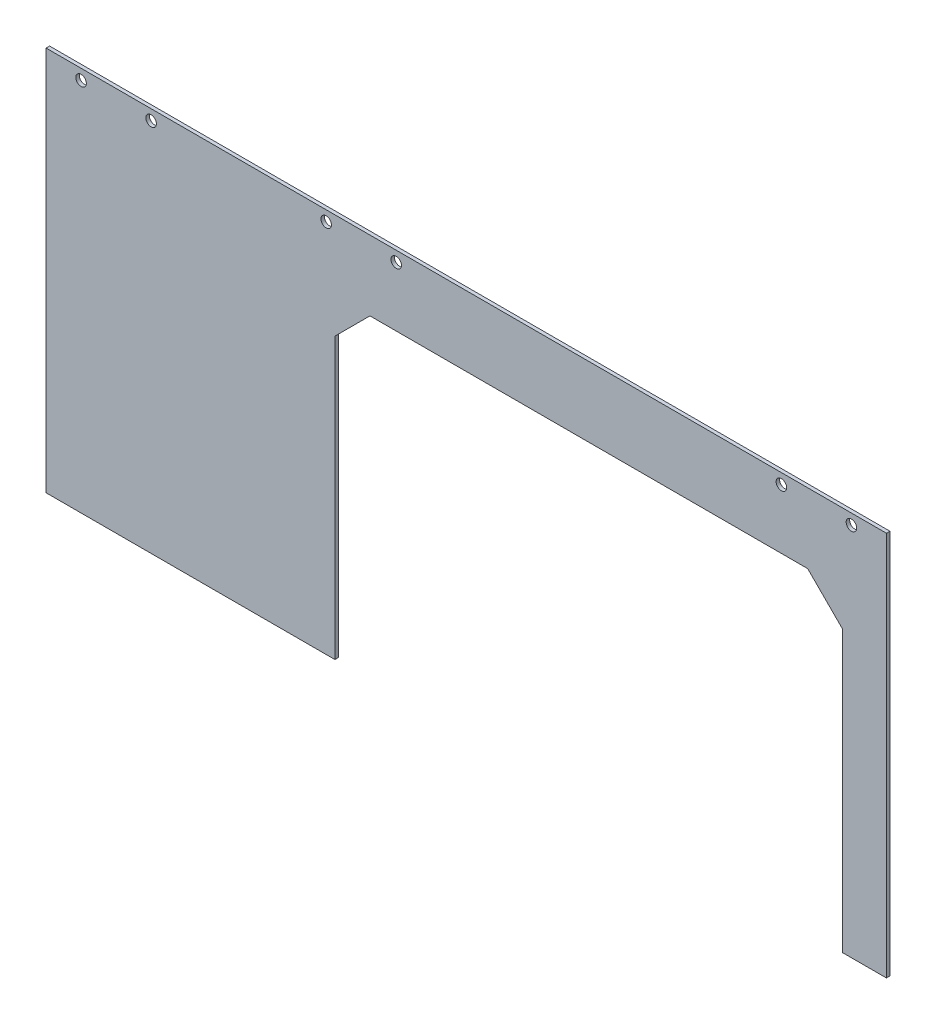
ISO-10303-21;
HEADER;
FILE_DESCRIPTION(('STEP AP214'),'2;1');
FILE_NAME('part.step','',(''),(''),'','','');
FILE_SCHEMA(('AUTOMOTIVE_DESIGN { 1 0 10303 214 1 1 1 1 }'));
ENDSEC;
DATA;
#1=APPLICATION_CONTEXT('core data for automotive mechanical design processes');
#2=APPLICATION_PROTOCOL_DEFINITION('international standard','automotive_design',2000,#1);
#3=PRODUCT_CONTEXT('',#1,'mechanical');
#4=PRODUCT('Part','Part','',(#3));
#5=PRODUCT_RELATED_PRODUCT_CATEGORY('part','',(#4));
#6=PRODUCT_DEFINITION_FORMATION('','',#4);
#7=PRODUCT_DEFINITION_CONTEXT('part definition',#1,'design');
#8=PRODUCT_DEFINITION('design','',#6,#7);
#9=PRODUCT_DEFINITION_SHAPE('','',#8);
#10=(LENGTH_UNIT() NAMED_UNIT(*) SI_UNIT(.MILLI.,.METRE.));
#11=(NAMED_UNIT(*) PLANE_ANGLE_UNIT() SI_UNIT($,.RADIAN.));
#12=(NAMED_UNIT(*) SI_UNIT($,.STERADIAN.) SOLID_ANGLE_UNIT());
#13=UNCERTAINTY_MEASURE_WITH_UNIT(LENGTH_MEASURE(1.E-05),#10,'distance_accuracy_value','');
#14=(GEOMETRIC_REPRESENTATION_CONTEXT(3) GLOBAL_UNCERTAINTY_ASSIGNED_CONTEXT((#13)) GLOBAL_UNIT_ASSIGNED_CONTEXT((#10,
#11,#12)) REPRESENTATION_CONTEXT('',''));
#15=CARTESIAN_POINT('',(0.,0.,0.));
#16=DIRECTION('',(0.,0.,1.));
#17=DIRECTION('',(1.,0.,0.));
#18=AXIS2_PLACEMENT_3D('',#15,#16,#17);
#19=CARTESIAN_POINT('',(0.,0.,1.));
#20=DIRECTION('',(0.,0.,-1.));
#21=DIRECTION('',(-1.,0.,0.));
#22=AXIS2_PLACEMENT_3D('',#19,#20,#21);
#23=PLANE('',#22);
#24=DIRECTION('',(1.,0.,0.));
#25=VECTOR('',#24,1.);
#26=CARTESIAN_POINT('',(82.5,0.,1.));
#27=LINE('',#26,#25);
#28=CARTESIAN_POINT('',(0.,0.,1.));
#29=VERTEX_POINT('',#28);
#30=CARTESIAN_POINT('',(82.5,0.,1.));
#31=VERTEX_POINT('',#30);
#32=EDGE_CURVE('E126',#29,#31,#27,.T.);
#33=ORIENTED_EDGE('',*,*,#32,.T.);
#34=DIRECTION('',(0.,1.,0.));
#35=VECTOR('',#34,1.);
#36=CARTESIAN_POINT('',(82.5,90.,1.));
#37=LINE('',#36,#35);
#38=CARTESIAN_POINT('',(82.5,80.,1.));
#39=VERTEX_POINT('',#38);
#40=EDGE_CURVE('E117',#31,#39,#37,.T.);
#41=ORIENTED_EDGE('',*,*,#40,.T.);
#42=DIRECTION('',(-0.707106781186551,-0.707106781186544,0.));
#43=VECTOR('',#42,1.);
#44=CARTESIAN_POINT('',(1.24999999999953,-1.24999999999954,1.));
#45=LINE('',#44,#43);
#46=CARTESIAN_POINT('',(92.5,90.,1.));
#47=VERTEX_POINT('',#46);
#48=EDGE_CURVE('E11',#39,#47,#45,.F.);
#49=ORIENTED_EDGE('',*,*,#48,.T.);
#50=DIRECTION('',(1.,0.,0.));
#51=VECTOR('',#50,1.);
#52=CARTESIAN_POINT('',(82.5,90.,1.));
#53=LINE('',#52,#51);
#54=CARTESIAN_POINT('',(217.5,90.,1.));
#55=VERTEX_POINT('',#54);
#56=EDGE_CURVE('E125',#47,#55,#53,.T.);
#57=ORIENTED_EDGE('',*,*,#56,.T.);
#58=DIRECTION('',(-0.707106781186544,0.707106781186551,0.));
#59=VECTOR('',#58,1.);
#60=CARTESIAN_POINT('',(153.750000000001,153.749999999999,1.));
#61=LINE('',#60,#59);
#62=CARTESIAN_POINT('',(227.5,79.9999999999998,1.));
#63=VERTEX_POINT('',#62);
#64=EDGE_CURVE('E158',#55,#63,#61,.F.);
#65=ORIENTED_EDGE('',*,*,#64,.T.);
#66=DIRECTION('',(0.,-1.,0.));
#67=VECTOR('',#66,1.);
#68=CARTESIAN_POINT('',(227.5,90.,1.));
#69=LINE('',#68,#67);
#70=CARTESIAN_POINT('',(227.5,0.,1.));
#71=VERTEX_POINT('',#70);
#72=EDGE_CURVE('E162',#63,#71,#69,.T.);
#73=ORIENTED_EDGE('',*,*,#72,.T.);
#74=DIRECTION('',(1.,0.,0.));
#75=VECTOR('',#74,1.);
#76=CARTESIAN_POINT('',(227.5,0.,1.));
#77=LINE('',#76,#75);
#78=CARTESIAN_POINT('',(240.,0.,1.));
#79=VERTEX_POINT('',#78);
#80=EDGE_CURVE('E172',#71,#79,#77,.T.);
#81=ORIENTED_EDGE('',*,*,#80,.T.);
#82=DIRECTION('',(0.,1.,0.));
#83=VECTOR('',#82,1.);
#84=CARTESIAN_POINT('',(240.,0.,1.));
#85=LINE('',#84,#83);
#86=CARTESIAN_POINT('',(240.,110.,1.));
#87=VERTEX_POINT('',#86);
#88=EDGE_CURVE('E211',#79,#87,#85,.T.);
#89=ORIENTED_EDGE('',*,*,#88,.T.);
#90=DIRECTION('',(-1.,0.,0.));
#91=VECTOR('',#90,1.);
#92=CARTESIAN_POINT('',(0.,110.,1.));
#93=LINE('',#92,#91);
#94=CARTESIAN_POINT('',(0.,110.,1.));
#95=VERTEX_POINT('',#94);
#96=EDGE_CURVE('E221',#87,#95,#93,.T.);
#97=ORIENTED_EDGE('',*,*,#96,.T.);
#98=DIRECTION('',(0.,-1.,0.));
#99=VECTOR('',#98,1.);
#100=CARTESIAN_POINT('',(0.,0.,1.));
#101=LINE('',#100,#99);
#102=EDGE_CURVE('E131',#95,#29,#101,.T.);
#103=ORIENTED_EDGE('',*,*,#102,.T.);
#104=EDGE_LOOP('',(#33,#41,#49,#57,#65,#73,#81,#89,#97,#103));
#105=FACE_BOUND('',#104,.T.);
#106=CARTESIAN_POINT('',(10.,107.,1.));
#107=DIRECTION('',(0.,0.,1.));
#108=DIRECTION('',(1.,0.,0.));
#109=AXIS2_PLACEMENT_3D('',#106,#107,#108);
#110=CIRCLE('',#109,1.5);
#111=CARTESIAN_POINT('',(11.5,107.,1.));
#112=VERTEX_POINT('',#111);
#113=EDGE_CURVE('E225',#112,#112,#110,.T.);
#114=ORIENTED_EDGE('',*,*,#113,.F.);
#115=EDGE_LOOP('',(#114));
#116=FACE_BOUND('',#115,.T.);
#117=CARTESIAN_POINT('',(30.,107.,1.));
#118=DIRECTION('',(0.,0.,1.));
#119=DIRECTION('',(1.,0.,0.));
#120=AXIS2_PLACEMENT_3D('',#117,#118,#119);
#121=CIRCLE('',#120,1.50000000000001);
#122=CARTESIAN_POINT('',(31.5,107.,1.));
#123=VERTEX_POINT('',#122);
#124=EDGE_CURVE('E232',#123,#123,#121,.T.);
#125=ORIENTED_EDGE('',*,*,#124,.F.);
#126=EDGE_LOOP('',(#125));
#127=FACE_BOUND('',#126,.T.);
#128=CARTESIAN_POINT('',(210.,107.,1.));
#129=DIRECTION('',(0.,0.,1.));
#130=DIRECTION('',(1.,0.,0.));
#131=AXIS2_PLACEMENT_3D('',#128,#129,#130);
#132=CIRCLE('',#131,1.5);
#133=CARTESIAN_POINT('',(211.5,107.,1.));
#134=VERTEX_POINT('',#133);
#135=EDGE_CURVE('E424',#134,#134,#132,.T.);
#136=ORIENTED_EDGE('',*,*,#135,.F.);
#137=EDGE_LOOP('',(#136));
#138=FACE_BOUND('',#137,.T.);
#139=CARTESIAN_POINT('',(230.,107.,1.));
#140=DIRECTION('',(0.,0.,1.));
#141=DIRECTION('',(1.,0.,0.));
#142=AXIS2_PLACEMENT_3D('',#139,#140,#141);
#143=CIRCLE('',#142,1.5);
#144=CARTESIAN_POINT('',(231.5,107.,1.));
#145=VERTEX_POINT('',#144);
#146=EDGE_CURVE('E418',#145,#145,#143,.T.);
#147=ORIENTED_EDGE('',*,*,#146,.F.);
#148=EDGE_LOOP('',(#147));
#149=FACE_BOUND('',#148,.T.);
#150=CARTESIAN_POINT('',(80.,107.,1.));
#151=DIRECTION('',(0.,0.,1.));
#152=DIRECTION('',(-1.,0.,0.));
#153=AXIS2_PLACEMENT_3D('',#150,#151,#152);
#154=CIRCLE('',#153,1.5);
#155=CARTESIAN_POINT('',(78.5,107.,1.));
#156=VERTEX_POINT('',#155);
#157=EDGE_CURVE('E412',#156,#156,#154,.T.);
#158=ORIENTED_EDGE('',*,*,#157,.F.);
#159=EDGE_LOOP('',(#158));
#160=FACE_BOUND('',#159,.T.);
#161=CARTESIAN_POINT('',(99.9999999999999,107.,1.));
#162=DIRECTION('',(0.,0.,1.));
#163=DIRECTION('',(-1.,0.,0.));
#164=AXIS2_PLACEMENT_3D('',#161,#162,#163);
#165=CIRCLE('',#164,1.5);
#166=CARTESIAN_POINT('',(98.4999999999999,107.,1.));
#167=VERTEX_POINT('',#166);
#168=EDGE_CURVE('E403',#167,#167,#165,.T.);
#169=ORIENTED_EDGE('',*,*,#168,.F.);
#170=EDGE_LOOP('',(#169));
#171=FACE_BOUND('',#170,.T.);
#172=ADVANCED_FACE('F43',(#105,#116,#127,#138,#149,#160,#171),#23,.F.);
#173=CARTESIAN_POINT('',(0.,0.,0.));
#174=DIRECTION('',(0.,0.,-1.));
#175=DIRECTION('',(-1.,0.,0.));
#176=AXIS2_PLACEMENT_3D('',#173,#174,#175);
#177=PLANE('',#176);
#178=CARTESIAN_POINT('',(80.,107.,0.));
#179=DIRECTION('',(0.,0.,1.));
#180=DIRECTION('',(-1.,0.,0.));
#181=AXIS2_PLACEMENT_3D('',#178,#179,#180);
#182=CIRCLE('',#181,1.5);
#183=CARTESIAN_POINT('',(78.5,107.,0.));
#184=VERTEX_POINT('',#183);
#185=EDGE_CURVE('E409',#184,#184,#182,.T.);
#186=ORIENTED_EDGE('',*,*,#185,.T.);
#187=EDGE_LOOP('',(#186));
#188=FACE_BOUND('',#187,.T.);
#189=CARTESIAN_POINT('',(210.,107.,0.));
#190=DIRECTION('',(0.,0.,1.));
#191=DIRECTION('',(1.,0.,0.));
#192=AXIS2_PLACEMENT_3D('',#189,#190,#191);
#193=CIRCLE('',#192,1.5);
#194=CARTESIAN_POINT('',(211.5,107.,0.));
#195=VERTEX_POINT('',#194);
#196=EDGE_CURVE('E421',#195,#195,#193,.T.);
#197=ORIENTED_EDGE('',*,*,#196,.T.);
#198=EDGE_LOOP('',(#197));
#199=FACE_BOUND('',#198,.T.);
#200=CARTESIAN_POINT('',(10.,107.,0.));
#201=DIRECTION('',(0.,0.,1.));
#202=DIRECTION('',(1.,0.,0.));
#203=AXIS2_PLACEMENT_3D('',#200,#201,#202);
#204=CIRCLE('',#203,1.5);
#205=CARTESIAN_POINT('',(11.5,107.,0.));
#206=VERTEX_POINT('',#205);
#207=EDGE_CURVE('E227',#206,#206,#204,.T.);
#208=ORIENTED_EDGE('',*,*,#207,.T.);
#209=EDGE_LOOP('',(#208));
#210=FACE_BOUND('',#209,.T.);
#211=DIRECTION('',(1.,0.,0.));
#212=VECTOR('',#211,1.);
#213=CARTESIAN_POINT('',(82.5,0.,0.));
#214=LINE('',#213,#212);
#215=CARTESIAN_POINT('',(0.,0.,0.));
#216=VERTEX_POINT('',#215);
#217=CARTESIAN_POINT('',(82.5,0.,0.));
#218=VERTEX_POINT('',#217);
#219=EDGE_CURVE('E139',#216,#218,#214,.T.);
#220=ORIENTED_EDGE('',*,*,#219,.F.);
#221=DIRECTION('',(0.,-1.,0.));
#222=VECTOR('',#221,1.);
#223=CARTESIAN_POINT('',(0.,0.,0.));
#224=LINE('',#223,#222);
#225=CARTESIAN_POINT('',(0.,110.,0.));
#226=VERTEX_POINT('',#225);
#227=EDGE_CURVE('E135',#226,#216,#224,.T.);
#228=ORIENTED_EDGE('',*,*,#227,.F.);
#229=DIRECTION('',(-1.,0.,0.));
#230=VECTOR('',#229,1.);
#231=CARTESIAN_POINT('',(0.,110.,0.));
#232=LINE('',#231,#230);
#233=CARTESIAN_POINT('',(240.,110.,0.));
#234=VERTEX_POINT('',#233);
#235=EDGE_CURVE('E194',#234,#226,#232,.T.);
#236=ORIENTED_EDGE('',*,*,#235,.F.);
#237=DIRECTION('',(0.,1.,0.));
#238=VECTOR('',#237,1.);
#239=CARTESIAN_POINT('',(240.,0.,0.));
#240=LINE('',#239,#238);
#241=CARTESIAN_POINT('',(240.,0.,0.));
#242=VERTEX_POINT('',#241);
#243=EDGE_CURVE('E192',#242,#234,#240,.T.);
#244=ORIENTED_EDGE('',*,*,#243,.F.);
#245=DIRECTION('',(1.,0.,0.));
#246=VECTOR('',#245,1.);
#247=CARTESIAN_POINT('',(227.5,0.,0.));
#248=LINE('',#247,#246);
#249=CARTESIAN_POINT('',(227.5,0.,0.));
#250=VERTEX_POINT('',#249);
#251=EDGE_CURVE('E186',#250,#242,#248,.T.);
#252=ORIENTED_EDGE('',*,*,#251,.F.);
#253=DIRECTION('',(0.,-1.,0.));
#254=VECTOR('',#253,1.);
#255=CARTESIAN_POINT('',(227.5,90.,0.));
#256=LINE('',#255,#254);
#257=CARTESIAN_POINT('',(227.5,79.9999999999998,0.));
#258=VERTEX_POINT('',#257);
#259=EDGE_CURVE('E180',#258,#250,#256,.T.);
#260=ORIENTED_EDGE('',*,*,#259,.F.);
#261=DIRECTION('',(0.707106781186544,-0.707106781186551,0.));
#262=VECTOR('',#261,1.);
#263=CARTESIAN_POINT('',(227.5,79.9999999999998,0.));
#264=LINE('',#263,#262);
#265=CARTESIAN_POINT('',(217.5,90.,0.));
#266=VERTEX_POINT('',#265);
#267=EDGE_CURVE('E156',#258,#266,#264,.F.);
#268=ORIENTED_EDGE('',*,*,#267,.T.);
#269=DIRECTION('',(1.,0.,0.));
#270=VECTOR('',#269,1.);
#271=CARTESIAN_POINT('',(82.5,90.,0.));
#272=LINE('',#271,#270);
#273=CARTESIAN_POINT('',(92.5,90.,0.));
#274=VERTEX_POINT('',#273);
#275=EDGE_CURVE('E178',#274,#266,#272,.T.);
#276=ORIENTED_EDGE('',*,*,#275,.F.);
#277=DIRECTION('',(0.707106781186551,0.707106781186544,0.));
#278=VECTOR('',#277,1.);
#279=CARTESIAN_POINT('',(92.5,90.,0.));
#280=LINE('',#279,#278);
#281=CARTESIAN_POINT('',(82.5,80.,0.));
#282=VERTEX_POINT('',#281);
#283=EDGE_CURVE('E52',#274,#282,#280,.F.);
#284=ORIENTED_EDGE('',*,*,#283,.T.);
#285=DIRECTION('',(0.,1.,0.));
#286=VECTOR('',#285,1.);
#287=CARTESIAN_POINT('',(82.5,90.,0.));
#288=LINE('',#287,#286);
#289=EDGE_CURVE('E184',#218,#282,#288,.T.);
#290=ORIENTED_EDGE('',*,*,#289,.F.);
#291=EDGE_LOOP('',(#220,#228,#236,#244,#252,#260,#268,#276,#284,#290));
#292=FACE_BOUND('',#291,.T.);
#293=CARTESIAN_POINT('',(30.,107.,0.));
#294=DIRECTION('',(0.,0.,1.));
#295=DIRECTION('',(1.,0.,0.));
#296=AXIS2_PLACEMENT_3D('',#293,#294,#295);
#297=CIRCLE('',#296,1.50000000000001);
#298=CARTESIAN_POINT('',(31.5,107.,0.));
#299=VERTEX_POINT('',#298);
#300=EDGE_CURVE('E235',#299,#299,#297,.T.);
#301=ORIENTED_EDGE('',*,*,#300,.T.);
#302=EDGE_LOOP('',(#301));
#303=FACE_BOUND('',#302,.T.);
#304=CARTESIAN_POINT('',(230.,107.,0.));
#305=DIRECTION('',(0.,0.,1.));
#306=DIRECTION('',(1.,0.,0.));
#307=AXIS2_PLACEMENT_3D('',#304,#305,#306);
#308=CIRCLE('',#307,1.5);
#309=CARTESIAN_POINT('',(231.5,107.,0.));
#310=VERTEX_POINT('',#309);
#311=EDGE_CURVE('E415',#310,#310,#308,.T.);
#312=ORIENTED_EDGE('',*,*,#311,.T.);
#313=EDGE_LOOP('',(#312));
#314=FACE_BOUND('',#313,.T.);
#315=CARTESIAN_POINT('',(99.9999999999999,107.,0.));
#316=DIRECTION('',(0.,0.,1.));
#317=DIRECTION('',(-1.,0.,0.));
#318=AXIS2_PLACEMENT_3D('',#315,#316,#317);
#319=CIRCLE('',#318,1.5);
#320=CARTESIAN_POINT('',(98.4999999999999,107.,0.));
#321=VERTEX_POINT('',#320);
#322=EDGE_CURVE('E406',#321,#321,#319,.T.);
#323=ORIENTED_EDGE('',*,*,#322,.T.);
#324=EDGE_LOOP('',(#323));
#325=FACE_BOUND('',#324,.T.);
#326=ADVANCED_FACE('F176',(#188,#199,#210,#292,#303,#314,#325),#177,.T.);
#327=CARTESIAN_POINT('',(82.5,0.,1.));
#328=DIRECTION('',(0.,1.,0.));
#329=DIRECTION('',(0.,0.,1.));
#330=AXIS2_PLACEMENT_3D('',#327,#328,#329);
#331=PLANE('',#330);
#332=ORIENTED_EDGE('',*,*,#219,.T.);
#333=DIRECTION('',(0.,0.,-1.));
#334=VECTOR('',#333,1.);
#335=CARTESIAN_POINT('',(82.5,0.,1.));
#336=LINE('',#335,#334);
#337=EDGE_CURVE('E121',#31,#218,#336,.T.);
#338=ORIENTED_EDGE('',*,*,#337,.F.);
#339=ORIENTED_EDGE('',*,*,#32,.F.);
#340=DIRECTION('',(0.,0.,-1.));
#341=VECTOR('',#340,1.);
#342=CARTESIAN_POINT('',(0.,0.,1.));
#343=LINE('',#342,#341);
#344=EDGE_CURVE('E197',#29,#216,#343,.T.);
#345=ORIENTED_EDGE('',*,*,#344,.T.);
#346=EDGE_LOOP('',(#332,#338,#339,#345));
#347=FACE_BOUND('',#346,.T.);
#348=ADVANCED_FACE('F137',(#347),#331,.F.);
#349=CARTESIAN_POINT('',(82.5,90.,1.));
#350=DIRECTION('',(-1.,0.,0.));
#351=DIRECTION('',(0.,-1.,0.));
#352=AXIS2_PLACEMENT_3D('',#349,#350,#351);
#353=PLANE('',#352);
#354=ORIENTED_EDGE('',*,*,#289,.T.);
#355=DIRECTION('',(0.,0.,1.));
#356=VECTOR('',#355,1.);
#357=CARTESIAN_POINT('',(82.5,80.,1.));
#358=LINE('',#357,#356);
#359=EDGE_CURVE('E59',#282,#39,#358,.T.);
#360=ORIENTED_EDGE('',*,*,#359,.T.);
#361=ORIENTED_EDGE('',*,*,#40,.F.);
#362=ORIENTED_EDGE('',*,*,#337,.T.);
#363=EDGE_LOOP('',(#354,#360,#361,#362));
#364=FACE_BOUND('',#363,.T.);
#365=ADVANCED_FACE('F119',(#364),#353,.F.);
#366=CARTESIAN_POINT('',(82.5,90.,1.));
#367=DIRECTION('',(0.,1.,0.));
#368=DIRECTION('',(0.,0.,1.));
#369=AXIS2_PLACEMENT_3D('',#366,#367,#368);
#370=PLANE('',#369);
#371=ORIENTED_EDGE('',*,*,#275,.T.);
#372=DIRECTION('',(0.,0.,1.));
#373=VECTOR('',#372,1.);
#374=CARTESIAN_POINT('',(217.5,90.,1.));
#375=LINE('',#374,#373);
#376=EDGE_CURVE('E153',#266,#55,#375,.T.);
#377=ORIENTED_EDGE('',*,*,#376,.T.);
#378=ORIENTED_EDGE('',*,*,#56,.F.);
#379=DIRECTION('',(0.,0.,-1.));
#380=VECTOR('',#379,1.);
#381=CARTESIAN_POINT('',(92.5,90.,0.));
#382=LINE('',#381,#380);
#383=EDGE_CURVE('E144',#47,#274,#382,.T.);
#384=ORIENTED_EDGE('',*,*,#383,.T.);
#385=EDGE_LOOP('',(#371,#377,#378,#384));
#386=FACE_BOUND('',#385,.T.);
#387=ADVANCED_FACE('F182',(#386),#370,.F.);
#388=CARTESIAN_POINT('',(227.5,90.,1.));
#389=DIRECTION('',(1.,0.,0.));
#390=DIRECTION('',(0.,1.,0.));
#391=AXIS2_PLACEMENT_3D('',#388,#389,#390);
#392=PLANE('',#391);
#393=ORIENTED_EDGE('',*,*,#72,.F.);
#394=DIRECTION('',(0.,0.,-1.));
#395=VECTOR('',#394,1.);
#396=CARTESIAN_POINT('',(227.5,79.9999999999998,0.));
#397=LINE('',#396,#395);
#398=EDGE_CURVE('E140',#63,#258,#397,.T.);
#399=ORIENTED_EDGE('',*,*,#398,.T.);
#400=ORIENTED_EDGE('',*,*,#259,.T.);
#401=DIRECTION('',(0.,0.,-1.));
#402=VECTOR('',#401,1.);
#403=CARTESIAN_POINT('',(227.5,0.,1.));
#404=LINE('',#403,#402);
#405=EDGE_CURVE('E141',#71,#250,#404,.T.);
#406=ORIENTED_EDGE('',*,*,#405,.F.);
#407=EDGE_LOOP('',(#393,#399,#400,#406));
#408=FACE_BOUND('',#407,.T.);
#409=ADVANCED_FACE('F169',(#408),#392,.F.);
#410=CARTESIAN_POINT('',(227.5,0.,1.));
#411=DIRECTION('',(0.,1.,0.));
#412=DIRECTION('',(-1.,0.,0.));
#413=AXIS2_PLACEMENT_3D('',#410,#411,#412);
#414=PLANE('',#413);
#415=ORIENTED_EDGE('',*,*,#251,.T.);
#416=DIRECTION('',(0.,0.,-1.));
#417=VECTOR('',#416,1.);
#418=CARTESIAN_POINT('',(240.,0.,1.));
#419=LINE('',#418,#417);
#420=EDGE_CURVE('E147',#79,#242,#419,.T.);
#421=ORIENTED_EDGE('',*,*,#420,.F.);
#422=ORIENTED_EDGE('',*,*,#80,.F.);
#423=ORIENTED_EDGE('',*,*,#405,.T.);
#424=EDGE_LOOP('',(#415,#421,#422,#423));
#425=FACE_BOUND('',#424,.T.);
#426=ADVANCED_FACE('F239',(#425),#414,.F.);
#427=CARTESIAN_POINT('',(240.,0.,1.));
#428=DIRECTION('',(-1.,0.,0.));
#429=DIRECTION('',(0.,0.,1.));
#430=AXIS2_PLACEMENT_3D('',#427,#428,#429);
#431=PLANE('',#430);
#432=ORIENTED_EDGE('',*,*,#243,.T.);
#433=DIRECTION('',(0.,0.,-1.));
#434=VECTOR('',#433,1.);
#435=CARTESIAN_POINT('',(240.,110.,1.));
#436=LINE('',#435,#434);
#437=EDGE_CURVE('E202',#87,#234,#436,.T.);
#438=ORIENTED_EDGE('',*,*,#437,.F.);
#439=ORIENTED_EDGE('',*,*,#88,.F.);
#440=ORIENTED_EDGE('',*,*,#420,.T.);
#441=EDGE_LOOP('',(#432,#438,#439,#440));
#442=FACE_BOUND('',#441,.T.);
#443=ADVANCED_FACE('F209',(#442),#431,.F.);
#444=CARTESIAN_POINT('',(0.,110.,1.));
#445=DIRECTION('',(0.,-1.,0.));
#446=DIRECTION('',(0.,0.,-1.));
#447=AXIS2_PLACEMENT_3D('',#444,#445,#446);
#448=PLANE('',#447);
#449=ORIENTED_EDGE('',*,*,#235,.T.);
#450=DIRECTION('',(0.,0.,-1.));
#451=VECTOR('',#450,1.);
#452=CARTESIAN_POINT('',(0.,110.,1.));
#453=LINE('',#452,#451);
#454=EDGE_CURVE('E199',#95,#226,#453,.T.);
#455=ORIENTED_EDGE('',*,*,#454,.F.);
#456=ORIENTED_EDGE('',*,*,#96,.F.);
#457=ORIENTED_EDGE('',*,*,#437,.T.);
#458=EDGE_LOOP('',(#449,#455,#456,#457));
#459=FACE_BOUND('',#458,.T.);
#460=ADVANCED_FACE('F217',(#459),#448,.F.);
#461=CARTESIAN_POINT('',(0.,0.,1.));
#462=DIRECTION('',(1.,0.,0.));
#463=DIRECTION('',(0.,0.,-1.));
#464=AXIS2_PLACEMENT_3D('',#461,#462,#463);
#465=PLANE('',#464);
#466=ORIENTED_EDGE('',*,*,#227,.T.);
#467=ORIENTED_EDGE('',*,*,#344,.F.);
#468=ORIENTED_EDGE('',*,*,#102,.F.);
#469=ORIENTED_EDGE('',*,*,#454,.T.);
#470=EDGE_LOOP('',(#466,#467,#468,#469));
#471=FACE_BOUND('',#470,.T.);
#472=ADVANCED_FACE('F220',(#471),#465,.F.);
#473=CARTESIAN_POINT('',(10.,107.,1.));
#474=DIRECTION('',(0.,0.,-1.));
#475=DIRECTION('',(-1.,0.,0.));
#476=AXIS2_PLACEMENT_3D('',#473,#474,#475);
#477=CYLINDRICAL_SURFACE('',#476,1.5);
#478=ORIENTED_EDGE('',*,*,#113,.T.);
#479=EDGE_LOOP('',(#478));
#480=FACE_BOUND('',#479,.T.);
#481=ORIENTED_EDGE('',*,*,#207,.F.);
#482=EDGE_LOOP('',(#481));
#483=FACE_BOUND('',#482,.T.);
#484=ADVANCED_FACE('F258',(#480,#483),#477,.F.);
#485=CARTESIAN_POINT('',(30.,107.,1.));
#486=DIRECTION('',(0.,0.,-1.));
#487=DIRECTION('',(-1.,0.,0.));
#488=AXIS2_PLACEMENT_3D('',#485,#486,#487);
#489=CYLINDRICAL_SURFACE('',#488,1.50000000000001);
#490=ORIENTED_EDGE('',*,*,#124,.T.);
#491=EDGE_LOOP('',(#490));
#492=FACE_BOUND('',#491,.T.);
#493=ORIENTED_EDGE('',*,*,#300,.F.);
#494=EDGE_LOOP('',(#493));
#495=FACE_BOUND('',#494,.T.);
#496=ADVANCED_FACE('F280',(#492,#495),#489,.F.);
#497=CARTESIAN_POINT('',(210.,107.,1.));
#498=DIRECTION('',(0.,0.,-1.));
#499=DIRECTION('',(-1.,0.,0.));
#500=AXIS2_PLACEMENT_3D('',#497,#498,#499);
#501=CYLINDRICAL_SURFACE('',#500,1.5);
#502=ORIENTED_EDGE('',*,*,#135,.T.);
#503=EDGE_LOOP('',(#502));
#504=FACE_BOUND('',#503,.T.);
#505=ORIENTED_EDGE('',*,*,#196,.F.);
#506=EDGE_LOOP('',(#505));
#507=FACE_BOUND('',#506,.T.);
#508=ADVANCED_FACE('F287',(#504,#507),#501,.F.);
#509=CARTESIAN_POINT('',(230.,107.,1.));
#510=DIRECTION('',(0.,0.,-1.));
#511=DIRECTION('',(-1.,0.,0.));
#512=AXIS2_PLACEMENT_3D('',#509,#510,#511);
#513=CYLINDRICAL_SURFACE('',#512,1.5);
#514=ORIENTED_EDGE('',*,*,#146,.T.);
#515=EDGE_LOOP('',(#514));
#516=FACE_BOUND('',#515,.T.);
#517=ORIENTED_EDGE('',*,*,#311,.F.);
#518=EDGE_LOOP('',(#517));
#519=FACE_BOUND('',#518,.T.);
#520=ADVANCED_FACE('F295',(#516,#519),#513,.F.);
#521=CARTESIAN_POINT('',(80.,107.,1.));
#522=DIRECTION('',(0.,0.,-1.));
#523=DIRECTION('',(-1.,0.,0.));
#524=AXIS2_PLACEMENT_3D('',#521,#522,#523);
#525=CYLINDRICAL_SURFACE('',#524,1.5);
#526=ORIENTED_EDGE('',*,*,#157,.T.);
#527=EDGE_LOOP('',(#526));
#528=FACE_BOUND('',#527,.T.);
#529=ORIENTED_EDGE('',*,*,#185,.F.);
#530=EDGE_LOOP('',(#529));
#531=FACE_BOUND('',#530,.T.);
#532=ADVANCED_FACE('F304',(#528,#531),#525,.F.);
#533=CARTESIAN_POINT('',(99.9999999999999,107.,1.));
#534=DIRECTION('',(0.,0.,-1.));
#535=DIRECTION('',(-1.,0.,0.));
#536=AXIS2_PLACEMENT_3D('',#533,#534,#535);
#537=CYLINDRICAL_SURFACE('',#536,1.5);
#538=ORIENTED_EDGE('',*,*,#168,.T.);
#539=EDGE_LOOP('',(#538));
#540=FACE_BOUND('',#539,.T.);
#541=ORIENTED_EDGE('',*,*,#322,.F.);
#542=EDGE_LOOP('',(#541));
#543=FACE_BOUND('',#542,.T.);
#544=ADVANCED_FACE('F312',(#540,#543),#537,.F.);
#545=CARTESIAN_POINT('',(227.5,79.9999999999998,1.));
#546=DIRECTION('',(-0.707106781186551,-0.707106781186543,0.));
#547=DIRECTION('',(0.,0.,1.));
#548=AXIS2_PLACEMENT_3D('',#545,#546,#547);
#549=PLANE('',#548);
#550=ORIENTED_EDGE('',*,*,#64,.F.);
#551=ORIENTED_EDGE('',*,*,#376,.F.);
#552=ORIENTED_EDGE('',*,*,#267,.F.);
#553=ORIENTED_EDGE('',*,*,#398,.F.);
#554=EDGE_LOOP('',(#550,#551,#552,#553));
#555=FACE_BOUND('',#554,.T.);
#556=ADVANCED_FACE('F174',(#555),#549,.T.);
#557=CARTESIAN_POINT('',(92.5,90.,1.));
#558=DIRECTION('',(0.707106781186544,-0.707106781186551,0.));
#559=DIRECTION('',(0.,0.,1.));
#560=AXIS2_PLACEMENT_3D('',#557,#558,#559);
#561=PLANE('',#560);
#562=ORIENTED_EDGE('',*,*,#48,.F.);
#563=ORIENTED_EDGE('',*,*,#359,.F.);
#564=ORIENTED_EDGE('',*,*,#283,.F.);
#565=ORIENTED_EDGE('',*,*,#383,.F.);
#566=EDGE_LOOP('',(#562,#563,#564,#565));
#567=FACE_BOUND('',#566,.T.);
#568=ADVANCED_FACE('F46',(#567),#561,.T.);
#569=CLOSED_SHELL('',(#172,#326,#348,#365,#387,#409,#426,#443,#460,#472,#484,#496,#508,#520,
#532,#544,#556,#568));
#570=MANIFOLD_SOLID_BREP('B2',#569);
#571=ADVANCED_BREP_SHAPE_REPRESENTATION('',(#18,#570),#14);
#572=SHAPE_DEFINITION_REPRESENTATION(#9,#571);
ENDSEC;
END-ISO-10303-21;
